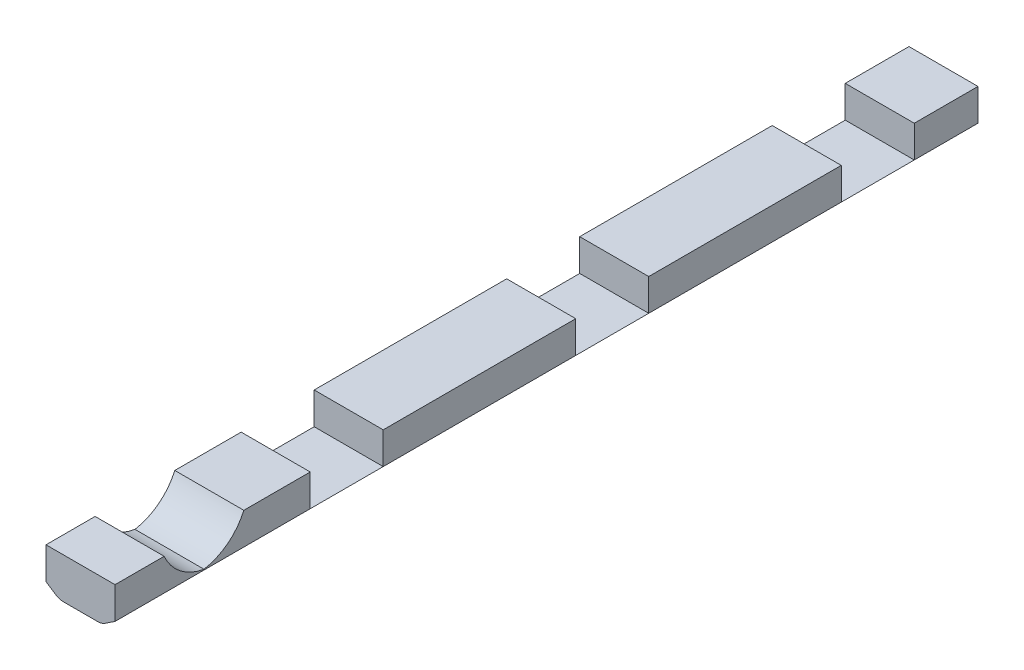
ISO-10303-21;
HEADER;
FILE_DESCRIPTION(('STEP AP214'),'2;1');
FILE_NAME('part.step','',(''),(''),'','','');
FILE_SCHEMA(('AUTOMOTIVE_DESIGN { 1 0 10303 214 1 1 1 1 }'));
ENDSEC;
DATA;
#1=APPLICATION_CONTEXT('core data for automotive mechanical design processes');
#2=APPLICATION_PROTOCOL_DEFINITION('international standard','automotive_design',2000,#1);
#3=PRODUCT_CONTEXT('',#1,'mechanical');
#4=PRODUCT('Part','Part','',(#3));
#5=PRODUCT_RELATED_PRODUCT_CATEGORY('part','',(#4));
#6=PRODUCT_DEFINITION_FORMATION('','',#4);
#7=PRODUCT_DEFINITION_CONTEXT('part definition',#1,'design');
#8=PRODUCT_DEFINITION('design','',#6,#7);
#9=PRODUCT_DEFINITION_SHAPE('','',#8);
#10=(LENGTH_UNIT() NAMED_UNIT(*) SI_UNIT(.MILLI.,.METRE.));
#11=(NAMED_UNIT(*) PLANE_ANGLE_UNIT() SI_UNIT($,.RADIAN.));
#12=(NAMED_UNIT(*) SI_UNIT($,.STERADIAN.) SOLID_ANGLE_UNIT());
#13=UNCERTAINTY_MEASURE_WITH_UNIT(LENGTH_MEASURE(1.E-05),#10,'distance_accuracy_value','');
#14=(GEOMETRIC_REPRESENTATION_CONTEXT(3) GLOBAL_UNCERTAINTY_ASSIGNED_CONTEXT((#13)) GLOBAL_UNIT_ASSIGNED_CONTEXT((#10,
#11,#12)) REPRESENTATION_CONTEXT('',''));
#15=CARTESIAN_POINT('',(0.,0.,0.));
#16=DIRECTION('',(0.,0.,1.));
#17=DIRECTION('',(1.,0.,0.));
#18=AXIS2_PLACEMENT_3D('',#15,#16,#17);
#19=CARTESIAN_POINT('',(5.,4.66332495807108,57.6339394440353));
#20=DIRECTION('',(1.,0.,0.));
#21=DIRECTION('',(0.,0.,-1.));
#22=AXIS2_PLACEMENT_3D('',#19,#20,#21);
#23=CYLINDRICAL_SURFACE('',#22,4.);
#24=CARTESIAN_POINT('',(4.2,4.66332495807108,57.6339394440353));
#25=DIRECTION('',(-1.,0.,0.));
#26=DIRECTION('',(0.,0.,1.));
#27=AXIS2_PLACEMENT_3D('',#24,#25,#26);
#28=CIRCLE('',#27,4.);
#29=CARTESIAN_POINT('',(4.2,0.719169365832354,58.3));
#30=VERTEX_POINT('',#29);
#31=CARTESIAN_POINT('',(4.2,3.06332495807108,61.3));
#32=VERTEX_POINT('',#31);
#33=EDGE_CURVE('E201',#30,#32,#28,.T.);
#34=ORIENTED_EDGE('',*,*,#33,.F.);
#35=DIRECTION('',(-1.,0.,0.));
#36=VECTOR('',#35,1.);
#37=CARTESIAN_POINT('',(1.6,0.719169365832354,58.3));
#38=LINE('',#37,#36);
#39=CARTESIAN_POINT('',(-0.999999999999999,0.719169365832354,58.3));
#40=VERTEX_POINT('',#39);
#41=EDGE_CURVE('E197',#40,#30,#38,.F.);
#42=ORIENTED_EDGE('',*,*,#41,.F.);
#43=CARTESIAN_POINT('',(-1.,4.66332495807108,57.6339394440353));
#44=DIRECTION('',(1.,0.,0.));
#45=DIRECTION('',(0.,1.,0.));
#46=AXIS2_PLACEMENT_3D('',#43,#44,#45);
#47=CIRCLE('',#46,4.);
#48=CARTESIAN_POINT('',(-1.,3.06332495807108,61.3));
#49=VERTEX_POINT('',#48);
#50=EDGE_CURVE('E192',#49,#40,#47,.T.);
#51=ORIENTED_EDGE('',*,*,#50,.F.);
#52=DIRECTION('',(-1.,0.,0.));
#53=VECTOR('',#52,1.);
#54=CARTESIAN_POINT('',(5.,3.06332495807108,61.3));
#55=LINE('',#54,#53);
#56=EDGE_CURVE('E195',#32,#49,#55,.T.);
#57=ORIENTED_EDGE('',*,*,#56,.F.);
#58=EDGE_LOOP('',(#34,#42,#51,#57));
#59=FACE_BOUND('',#58,.T.);
#60=ADVANCED_FACE('F37',(#59),#23,.F.);
#61=CARTESIAN_POINT('',(4.2,3.06332495807108,65.));
#62=DIRECTION('',(0.,-1.,0.));
#63=DIRECTION('',(0.,0.,-1.));
#64=AXIS2_PLACEMENT_3D('',#61,#62,#63);
#65=PLANE('',#64);
#66=DIRECTION('',(0.,0.,-1.));
#67=VECTOR('',#66,1.);
#68=CARTESIAN_POINT('',(4.2,3.06332495807108,65.));
#69=LINE('',#68,#67);
#70=CARTESIAN_POINT('',(4.2,3.06332495807108,65.));
#71=VERTEX_POINT('',#70);
#72=EDGE_CURVE('E211',#71,#32,#69,.T.);
#73=ORIENTED_EDGE('',*,*,#72,.T.);
#74=ORIENTED_EDGE('',*,*,#56,.T.);
#75=DIRECTION('',(0.,0.,-1.));
#76=VECTOR('',#75,1.);
#77=CARTESIAN_POINT('',(-1.,3.06332495807108,65.));
#78=LINE('',#77,#76);
#79=CARTESIAN_POINT('',(-1.,3.06332495807108,65.));
#80=VERTEX_POINT('',#79);
#81=EDGE_CURVE('E208',#80,#49,#78,.T.);
#82=ORIENTED_EDGE('',*,*,#81,.F.);
#83=DIRECTION('',(-1.,0.,0.));
#84=VECTOR('',#83,1.);
#85=CARTESIAN_POINT('',(4.2,3.06332495807108,65.));
#86=LINE('',#85,#84);
#87=EDGE_CURVE('E340',#71,#80,#86,.T.);
#88=ORIENTED_EDGE('',*,*,#87,.F.);
#89=EDGE_LOOP('',(#73,#74,#82,#88));
#90=FACE_BOUND('',#89,.T.);
#91=ADVANCED_FACE('F206',(#90),#65,.F.);
#92=CARTESIAN_POINT('',(4.2,0.66332495807108,65.));
#93=DIRECTION('',(-1.,0.,0.));
#94=DIRECTION('',(0.,0.,1.));
#95=AXIS2_PLACEMENT_3D('',#92,#93,#94);
#96=PLANE('',#95);
#97=CARTESIAN_POINT('',(4.2,3.06332495807108,24.8));
#98=VERTEX_POINT('',#97);
#99=CARTESIAN_POINT('',(4.2,3.06332495807108,10.3));
#100=VERTEX_POINT('',#99);
#101=EDGE_CURVE('E223',#98,#100,#69,.T.);
#102=ORIENTED_EDGE('',*,*,#101,.F.);
#103=DIRECTION('',(0.,-1.,0.));
#104=VECTOR('',#103,1.);
#105=CARTESIAN_POINT('',(4.2,0.663324958071065,24.8));
#106=LINE('',#105,#104);
#107=CARTESIAN_POINT('',(4.2,0.663324958071081,24.8));
#108=VERTEX_POINT('',#107);
#109=EDGE_CURVE('E299',#98,#108,#106,.T.);
#110=ORIENTED_EDGE('',*,*,#109,.T.);
#111=DIRECTION('',(0.,0.,-1.));
#112=VECTOR('',#111,1.);
#113=CARTESIAN_POINT('',(4.2,0.66332495807108,65.));
#114=LINE('',#113,#112);
#115=CARTESIAN_POINT('',(4.2,0.663324958071081,10.3));
#116=VERTEX_POINT('',#115);
#117=EDGE_CURVE('E387',#108,#116,#114,.T.);
#118=ORIENTED_EDGE('',*,*,#117,.T.);
#119=DIRECTION('',(0.,1.,0.));
#120=VECTOR('',#119,1.);
#121=CARTESIAN_POINT('',(4.2,0.66332495807108,10.3));
#122=LINE('',#121,#120);
#123=EDGE_CURVE('E324',#116,#100,#122,.T.);
#124=ORIENTED_EDGE('',*,*,#123,.T.);
#125=EDGE_LOOP('',(#102,#110,#118,#124));
#126=FACE_BOUND('',#125,.T.);
#127=ADVANCED_FACE('F406',(#126),#96,.F.);
#128=CARTESIAN_POINT('',(4.2,0.663324958071081,44.8));
#129=VERTEX_POINT('',#128);
#130=CARTESIAN_POINT('',(4.2,0.663324958071081,30.3));
#131=VERTEX_POINT('',#130);
#132=EDGE_CURVE('E386',#129,#131,#114,.T.);
#133=ORIENTED_EDGE('',*,*,#132,.T.);
#134=DIRECTION('',(0.,1.,0.));
#135=VECTOR('',#134,1.);
#136=CARTESIAN_POINT('',(4.2,0.66332495807108,30.3));
#137=LINE('',#136,#135);
#138=CARTESIAN_POINT('',(4.2,3.06332495807108,30.3));
#139=VERTEX_POINT('',#138);
#140=EDGE_CURVE('E297',#131,#139,#137,.T.);
#141=ORIENTED_EDGE('',*,*,#140,.T.);
#142=CARTESIAN_POINT('',(4.2,3.06332495807108,44.8));
#143=VERTEX_POINT('',#142);
#144=EDGE_CURVE('E225',#143,#139,#69,.T.);
#145=ORIENTED_EDGE('',*,*,#144,.F.);
#146=DIRECTION('',(0.,-1.,0.));
#147=VECTOR('',#146,1.);
#148=CARTESIAN_POINT('',(4.2,0.663324958071072,44.8));
#149=LINE('',#148,#147);
#150=EDGE_CURVE('E291',#143,#129,#149,.T.);
#151=ORIENTED_EDGE('',*,*,#150,.T.);
#152=EDGE_LOOP('',(#133,#141,#145,#151));
#153=FACE_BOUND('',#152,.T.);
#154=ADVANCED_FACE('F412',(#153),#96,.F.);
#155=CARTESIAN_POINT('',(-1.,3.06332495807108,24.8));
#156=VERTEX_POINT('',#155);
#157=CARTESIAN_POINT('',(-1.,3.06332495807108,10.3));
#158=VERTEX_POINT('',#157);
#159=EDGE_CURVE('E227',#156,#158,#78,.T.);
#160=ORIENTED_EDGE('',*,*,#159,.F.);
#161=DIRECTION('',(-1.,0.,0.));
#162=VECTOR('',#161,1.);
#163=CARTESIAN_POINT('',(5.,3.06332495807108,24.8));
#164=LINE('',#163,#162);
#165=EDGE_CURVE('E257',#98,#156,#164,.T.);
#166=ORIENTED_EDGE('',*,*,#165,.F.);
#167=ORIENTED_EDGE('',*,*,#101,.T.);
#168=DIRECTION('',(-1.,0.,0.));
#169=VECTOR('',#168,1.);
#170=CARTESIAN_POINT('',(5.,3.06332495807108,10.3));
#171=LINE('',#170,#169);
#172=EDGE_CURVE('E314',#100,#158,#171,.T.);
#173=ORIENTED_EDGE('',*,*,#172,.T.);
#174=EDGE_LOOP('',(#160,#166,#167,#173));
#175=FACE_BOUND('',#174,.T.);
#176=ADVANCED_FACE('F399',(#175),#65,.F.);
#177=ORIENTED_EDGE('',*,*,#144,.T.);
#178=DIRECTION('',(-1.,0.,0.));
#179=VECTOR('',#178,1.);
#180=CARTESIAN_POINT('',(5.,3.06332495807108,30.3));
#181=LINE('',#180,#179);
#182=CARTESIAN_POINT('',(-1.,3.06332495807108,30.3));
#183=VERTEX_POINT('',#182);
#184=EDGE_CURVE('E254',#139,#183,#181,.T.);
#185=ORIENTED_EDGE('',*,*,#184,.T.);
#186=CARTESIAN_POINT('',(-1.,3.06332495807108,44.8));
#187=VERTEX_POINT('',#186);
#188=EDGE_CURVE('E226',#187,#183,#78,.T.);
#189=ORIENTED_EDGE('',*,*,#188,.F.);
#190=DIRECTION('',(-1.,0.,0.));
#191=VECTOR('',#190,1.);
#192=CARTESIAN_POINT('',(5.,3.06332495807108,44.8));
#193=LINE('',#192,#191);
#194=EDGE_CURVE('E252',#143,#187,#193,.T.);
#195=ORIENTED_EDGE('',*,*,#194,.F.);
#196=EDGE_LOOP('',(#177,#185,#189,#195));
#197=FACE_BOUND('',#196,.T.);
#198=ADVANCED_FACE('F251',(#197),#65,.F.);
#199=CARTESIAN_POINT('',(-1.,3.06332495807108,65.));
#200=DIRECTION('',(1.,0.,0.));
#201=DIRECTION('',(0.,1.,0.));
#202=AXIS2_PLACEMENT_3D('',#199,#200,#201);
#203=PLANE('',#202);
#204=DIRECTION('',(0.,0.,-1.));
#205=VECTOR('',#204,1.);
#206=CARTESIAN_POINT('',(-1.,0.663324958071081,65.));
#207=LINE('',#206,#205);
#208=CARTESIAN_POINT('',(-1.,0.663324958071081,24.8));
#209=VERTEX_POINT('',#208);
#210=CARTESIAN_POINT('',(-1.,0.663324958071081,10.3));
#211=VERTEX_POINT('',#210);
#212=EDGE_CURVE('E236',#209,#211,#207,.T.);
#213=ORIENTED_EDGE('',*,*,#212,.F.);
#214=DIRECTION('',(0.,-1.,0.));
#215=VECTOR('',#214,1.);
#216=CARTESIAN_POINT('',(-1.,3.06332495807108,24.8));
#217=LINE('',#216,#215);
#218=EDGE_CURVE('E277',#156,#209,#217,.T.);
#219=ORIENTED_EDGE('',*,*,#218,.F.);
#220=ORIENTED_EDGE('',*,*,#159,.T.);
#221=DIRECTION('',(0.,1.,0.));
#222=VECTOR('',#221,1.);
#223=CARTESIAN_POINT('',(-1.,3.06332495807108,10.3));
#224=LINE('',#223,#222);
#225=EDGE_CURVE('E307',#211,#158,#224,.T.);
#226=ORIENTED_EDGE('',*,*,#225,.F.);
#227=EDGE_LOOP('',(#213,#219,#220,#226));
#228=FACE_BOUND('',#227,.T.);
#229=ADVANCED_FACE('F477',(#228),#203,.F.);
#230=ORIENTED_EDGE('',*,*,#188,.T.);
#231=DIRECTION('',(0.,1.,0.));
#232=VECTOR('',#231,1.);
#233=CARTESIAN_POINT('',(-1.,3.06332495807108,30.3));
#234=LINE('',#233,#232);
#235=CARTESIAN_POINT('',(-1.,0.663324958071081,30.3));
#236=VERTEX_POINT('',#235);
#237=EDGE_CURVE('E245',#236,#183,#234,.T.);
#238=ORIENTED_EDGE('',*,*,#237,.F.);
#239=CARTESIAN_POINT('',(-1.,0.663324958071081,44.8));
#240=VERTEX_POINT('',#239);
#241=EDGE_CURVE('E235',#240,#236,#207,.T.);
#242=ORIENTED_EDGE('',*,*,#241,.F.);
#243=DIRECTION('',(0.,-1.,0.));
#244=VECTOR('',#243,1.);
#245=CARTESIAN_POINT('',(-1.,3.06332495807108,44.8));
#246=LINE('',#245,#244);
#247=EDGE_CURVE('E212',#187,#240,#246,.T.);
#248=ORIENTED_EDGE('',*,*,#247,.F.);
#249=EDGE_LOOP('',(#230,#238,#242,#248));
#250=FACE_BOUND('',#249,.T.);
#251=ADVANCED_FACE('F243',(#250),#203,.F.);
#252=CARTESIAN_POINT('',(4.2,3.06332495807108,4.8));
#253=VERTEX_POINT('',#252);
#254=CARTESIAN_POINT('',(4.2,3.06332495807108,0.));
#255=VERTEX_POINT('',#254);
#256=EDGE_CURVE('E219',#253,#255,#69,.T.);
#257=ORIENTED_EDGE('',*,*,#256,.F.);
#258=DIRECTION('',(0.,-1.,0.));
#259=VECTOR('',#258,1.);
#260=CARTESIAN_POINT('',(4.2,0.663324958071058,4.8));
#261=LINE('',#260,#259);
#262=CARTESIAN_POINT('',(4.2,0.663324958071081,4.8));
#263=VERTEX_POINT('',#262);
#264=EDGE_CURVE('E327',#253,#263,#261,.T.);
#265=ORIENTED_EDGE('',*,*,#264,.T.);
#266=CARTESIAN_POINT('',(4.2,0.66332495807108,0.));
#267=VERTEX_POINT('',#266);
#268=EDGE_CURVE('E388',#263,#267,#114,.T.);
#269=ORIENTED_EDGE('',*,*,#268,.T.);
#270=DIRECTION('',(0.,1.,0.));
#271=VECTOR('',#270,1.);
#272=CARTESIAN_POINT('',(4.2,0.66332495807108,0.));
#273=LINE('',#272,#271);
#274=EDGE_CURVE('E348',#267,#255,#273,.T.);
#275=ORIENTED_EDGE('',*,*,#274,.T.);
#276=EDGE_LOOP('',(#257,#265,#269,#275));
#277=FACE_BOUND('',#276,.T.);
#278=ADVANCED_FACE('F460',(#277),#96,.F.);
#279=CARTESIAN_POINT('',(-1.,3.06332495807108,4.8));
#280=VERTEX_POINT('',#279);
#281=CARTESIAN_POINT('',(-1.,3.06332495807108,0.));
#282=VERTEX_POINT('',#281);
#283=EDGE_CURVE('E222',#280,#282,#78,.T.);
#284=ORIENTED_EDGE('',*,*,#283,.F.);
#285=DIRECTION('',(-1.,0.,0.));
#286=VECTOR('',#285,1.);
#287=CARTESIAN_POINT('',(5.,3.06332495807108,4.8));
#288=LINE('',#287,#286);
#289=EDGE_CURVE('E311',#253,#280,#288,.T.);
#290=ORIENTED_EDGE('',*,*,#289,.F.);
#291=ORIENTED_EDGE('',*,*,#256,.T.);
#292=DIRECTION('',(-1.,0.,0.));
#293=VECTOR('',#292,1.);
#294=CARTESIAN_POINT('',(4.2,3.06332495807108,0.));
#295=LINE('',#294,#293);
#296=EDGE_CURVE('E351',#255,#282,#295,.T.);
#297=ORIENTED_EDGE('',*,*,#296,.T.);
#298=EDGE_LOOP('',(#284,#290,#291,#297));
#299=FACE_BOUND('',#298,.T.);
#300=ADVANCED_FACE('F466',(#299),#65,.F.);
#301=CARTESIAN_POINT('',(-1.,0.663324958071081,4.8));
#302=VERTEX_POINT('',#301);
#303=CARTESIAN_POINT('',(-1.,0.663324958071081,0.));
#304=VERTEX_POINT('',#303);
#305=EDGE_CURVE('E237',#302,#304,#207,.T.);
#306=ORIENTED_EDGE('',*,*,#305,.F.);
#307=DIRECTION('',(0.,-1.,0.));
#308=VECTOR('',#307,1.);
#309=CARTESIAN_POINT('',(-1.,3.06332495807108,4.8));
#310=LINE('',#309,#308);
#311=EDGE_CURVE('E302',#280,#302,#310,.T.);
#312=ORIENTED_EDGE('',*,*,#311,.F.);
#313=ORIENTED_EDGE('',*,*,#283,.T.);
#314=DIRECTION('',(0.,-1.,0.));
#315=VECTOR('',#314,1.);
#316=CARTESIAN_POINT('',(-1.,3.06332495807108,0.));
#317=LINE('',#316,#315);
#318=EDGE_CURVE('E334',#282,#304,#317,.T.);
#319=ORIENTED_EDGE('',*,*,#318,.T.);
#320=EDGE_LOOP('',(#306,#312,#313,#319));
#321=FACE_BOUND('',#320,.T.);
#322=ADVANCED_FACE('F355',(#321),#203,.F.);
#323=CARTESIAN_POINT('',(-1.,0.663324958071081,65.));
#324=DIRECTION('',(0.552770798392567,0.833333333333333,0.));
#325=DIRECTION('',(-0.833333333333333,0.552770798392567,0.));
#326=AXIS2_PLACEMENT_3D('',#323,#324,#325);
#327=PLANE('',#326);
#328=DIRECTION('',(0.833333333333333,-0.552770798392567,0.));
#329=VECTOR('',#328,1.);
#330=CARTESIAN_POINT('',(-1.,0.663324958071081,0.));
#331=LINE('',#330,#329);
#332=CARTESIAN_POINT('',(-0.251259453814803,0.166666666666667,0.));
#333=VERTEX_POINT('',#332);
#334=EDGE_CURVE('E330',#304,#333,#331,.T.);
#335=ORIENTED_EDGE('',*,*,#334,.T.);
#336=DIRECTION('',(0.,0.,-1.));
#337=VECTOR('',#336,1.);
#338=CARTESIAN_POINT('',(-0.251259453814803,0.166666666666667,65.));
#339=LINE('',#338,#337);
#340=CARTESIAN_POINT('',(-0.251259453814803,0.166666666666667,65.));
#341=VERTEX_POINT('',#340);
#342=EDGE_CURVE('E45',#333,#341,#339,.F.);
#343=ORIENTED_EDGE('',*,*,#342,.T.);
#344=DIRECTION('',(0.833333333333333,-0.552770798392567,0.));
#345=VECTOR('',#344,1.);
#346=CARTESIAN_POINT('',(-1.,0.663324958071081,65.));
#347=LINE('',#346,#345);
#348=CARTESIAN_POINT('',(-1.,0.663324958071081,65.));
#349=VERTEX_POINT('',#348);
#350=EDGE_CURVE('E331',#349,#341,#347,.T.);
#351=ORIENTED_EDGE('',*,*,#350,.F.);
#352=CARTESIAN_POINT('',(-1.,0.663324958071081,50.3));
#353=VERTEX_POINT('',#352);
#354=EDGE_CURVE('E229',#349,#353,#207,.T.);
#355=ORIENTED_EDGE('',*,*,#354,.T.);
#356=DIRECTION('',(0.,0.,1.));
#357=VECTOR('',#356,1.);
#358=CARTESIAN_POINT('',(-1.,0.663324958071081,44.8));
#359=LINE('',#358,#357);
#360=EDGE_CURVE('E269',#240,#353,#359,.T.);
#361=ORIENTED_EDGE('',*,*,#360,.F.);
#362=ORIENTED_EDGE('',*,*,#241,.T.);
#363=DIRECTION('',(0.,0.,1.));
#364=VECTOR('',#363,1.);
#365=CARTESIAN_POINT('',(-1.,0.663324958071081,24.8));
#366=LINE('',#365,#364);
#367=EDGE_CURVE('E426',#209,#236,#366,.T.);
#368=ORIENTED_EDGE('',*,*,#367,.F.);
#369=ORIENTED_EDGE('',*,*,#212,.T.);
#370=DIRECTION('',(0.,0.,1.));
#371=VECTOR('',#370,1.);
#372=CARTESIAN_POINT('',(-1.,0.663324958071081,4.8));
#373=LINE('',#372,#371);
#374=EDGE_CURVE('E304',#302,#211,#373,.T.);
#375=ORIENTED_EDGE('',*,*,#374,.F.);
#376=ORIENTED_EDGE('',*,*,#305,.T.);
#377=EDGE_LOOP('',(#335,#343,#351,#355,#361,#362,#368,#369,#375,#376));
#378=FACE_BOUND('',#377,.T.);
#379=ADVANCED_FACE('F359',(#378),#327,.F.);
#380=CARTESIAN_POINT('',(0.,0.,65.));
#381=DIRECTION('',(0.,1.,0.));
#382=DIRECTION('',(0.,0.,1.));
#383=AXIS2_PLACEMENT_3D('',#380,#381,#382);
#384=PLANE('',#383);
#385=DIRECTION('',(1.,0.,0.));
#386=VECTOR('',#385,1.);
#387=CARTESIAN_POINT('',(0.,0.,65.));
#388=LINE('',#387,#386);
#389=CARTESIAN_POINT('',(0.301511344577764,0.,65.));
#390=VERTEX_POINT('',#389);
#391=CARTESIAN_POINT('',(2.89848865542224,0.,65.));
#392=VERTEX_POINT('',#391);
#393=EDGE_CURVE('E333',#390,#392,#388,.T.);
#394=ORIENTED_EDGE('',*,*,#393,.F.);
#395=DIRECTION('',(0.,0.,-1.));
#396=VECTOR('',#395,1.);
#397=CARTESIAN_POINT('',(0.301511344577764,0.,65.));
#398=LINE('',#397,#396);
#399=CARTESIAN_POINT('',(0.301511344577764,0.,0.));
#400=VERTEX_POINT('',#399);
#401=EDGE_CURVE('E364',#390,#400,#398,.T.);
#402=ORIENTED_EDGE('',*,*,#401,.T.);
#403=DIRECTION('',(1.,0.,0.));
#404=VECTOR('',#403,1.);
#405=CARTESIAN_POINT('',(0.,0.,0.));
#406=LINE('',#405,#404);
#407=CARTESIAN_POINT('',(2.89848865542224,0.,0.));
#408=VERTEX_POINT('',#407);
#409=EDGE_CURVE('E344',#400,#408,#406,.T.);
#410=ORIENTED_EDGE('',*,*,#409,.T.);
#411=DIRECTION('',(0.,0.,-1.));
#412=VECTOR('',#411,1.);
#413=CARTESIAN_POINT('',(2.89848865542224,0.,65.));
#414=LINE('',#413,#412);
#415=EDGE_CURVE('E370',#408,#392,#414,.F.);
#416=ORIENTED_EDGE('',*,*,#415,.T.);
#417=EDGE_LOOP('',(#394,#402,#410,#416));
#418=FACE_BOUND('',#417,.T.);
#419=ADVANCED_FACE('F606',(#418),#384,.F.);
#420=CARTESIAN_POINT('',(3.2,0.,65.));
#421=DIRECTION('',(-0.552770798392567,0.833333333333333,0.));
#422=DIRECTION('',(-0.833333333333333,-0.552770798392567,0.));
#423=AXIS2_PLACEMENT_3D('',#420,#421,#422);
#424=PLANE('',#423);
#425=DIRECTION('',(0.833333333333333,0.552770798392567,0.));
#426=VECTOR('',#425,1.);
#427=CARTESIAN_POINT('',(3.2,0.,65.));
#428=LINE('',#427,#426);
#429=CARTESIAN_POINT('',(3.4512594538148,0.166666666666667,65.));
#430=VERTEX_POINT('',#429);
#431=CARTESIAN_POINT('',(4.2,0.66332495807108,65.));
#432=VERTEX_POINT('',#431);
#433=EDGE_CURVE('E336',#430,#432,#428,.T.);
#434=ORIENTED_EDGE('',*,*,#433,.F.);
#435=DIRECTION('',(0.,0.,-1.));
#436=VECTOR('',#435,1.);
#437=CARTESIAN_POINT('',(3.4512594538148,0.166666666666667,65.));
#438=LINE('',#437,#436);
#439=CARTESIAN_POINT('',(3.4512594538148,0.166666666666667,0.));
#440=VERTEX_POINT('',#439);
#441=EDGE_CURVE('E376',#430,#440,#438,.T.);
#442=ORIENTED_EDGE('',*,*,#441,.T.);
#443=DIRECTION('',(0.833333333333333,0.552770798392567,0.));
#444=VECTOR('',#443,1.);
#445=CARTESIAN_POINT('',(3.2,0.,0.));
#446=LINE('',#445,#444);
#447=EDGE_CURVE('E346',#440,#267,#446,.T.);
#448=ORIENTED_EDGE('',*,*,#447,.T.);
#449=ORIENTED_EDGE('',*,*,#268,.F.);
#450=DIRECTION('',(0.,0.,1.));
#451=VECTOR('',#450,1.);
#452=CARTESIAN_POINT('',(4.2,0.663324958071081,65.));
#453=LINE('',#452,#451);
#454=EDGE_CURVE('E313',#263,#116,#453,.T.);
#455=ORIENTED_EDGE('',*,*,#454,.T.);
#456=ORIENTED_EDGE('',*,*,#117,.F.);
#457=DIRECTION('',(0.,0.,1.));
#458=VECTOR('',#457,1.);
#459=CARTESIAN_POINT('',(4.2,0.663324958071081,65.));
#460=LINE('',#459,#458);
#461=EDGE_CURVE('E294',#108,#131,#460,.T.);
#462=ORIENTED_EDGE('',*,*,#461,.T.);
#463=ORIENTED_EDGE('',*,*,#132,.F.);
#464=DIRECTION('',(0.,0.,1.));
#465=VECTOR('',#464,1.);
#466=CARTESIAN_POINT('',(4.2,0.663324958071081,65.));
#467=LINE('',#466,#465);
#468=CARTESIAN_POINT('',(4.2,0.663324958071081,50.3));
#469=VERTEX_POINT('',#468);
#470=EDGE_CURVE('E260',#129,#469,#467,.T.);
#471=ORIENTED_EDGE('',*,*,#470,.T.);
#472=EDGE_CURVE('E385',#432,#469,#114,.T.);
#473=ORIENTED_EDGE('',*,*,#472,.F.);
#474=EDGE_LOOP('',(#434,#442,#448,#449,#455,#456,#462,#463,#471,#473));
#475=FACE_BOUND('',#474,.T.);
#476=ADVANCED_FACE('F414',(#475),#424,.F.);
#477=CARTESIAN_POINT('',(4.2,4.66332495807108,58.9660605559647));
#478=DIRECTION('',(-1.,0.,0.));
#479=DIRECTION('',(0.,0.,1.));
#480=AXIS2_PLACEMENT_3D('',#477,#478,#479);
#481=CIRCLE('',#480,4.);
#482=CARTESIAN_POINT('',(4.2,3.06332495807108,55.3));
#483=VERTEX_POINT('',#482);
#484=EDGE_CURVE('E381',#483,#30,#481,.T.);
#485=ORIENTED_EDGE('',*,*,#484,.T.);
#486=ORIENTED_EDGE('',*,*,#33,.T.);
#487=ORIENTED_EDGE('',*,*,#72,.F.);
#488=DIRECTION('',(0.,1.,0.));
#489=VECTOR('',#488,1.);
#490=CARTESIAN_POINT('',(4.2,0.66332495807108,65.));
#491=LINE('',#490,#489);
#492=EDGE_CURVE('E338',#432,#71,#491,.T.);
#493=ORIENTED_EDGE('',*,*,#492,.F.);
#494=ORIENTED_EDGE('',*,*,#472,.T.);
#495=DIRECTION('',(0.,1.,0.));
#496=VECTOR('',#495,1.);
#497=CARTESIAN_POINT('',(4.2,0.66332495807108,50.3));
#498=LINE('',#497,#496);
#499=CARTESIAN_POINT('',(4.2,3.06332495807108,50.3));
#500=VERTEX_POINT('',#499);
#501=EDGE_CURVE('E288',#469,#500,#498,.T.);
#502=ORIENTED_EDGE('',*,*,#501,.T.);
#503=EDGE_CURVE('E389',#483,#500,#69,.T.);
#504=ORIENTED_EDGE('',*,*,#503,.F.);
#505=EDGE_LOOP('',(#485,#486,#487,#493,#494,#502,#504));
#506=FACE_BOUND('',#505,.T.);
#507=ADVANCED_FACE('F447',(#506),#96,.F.);
#508=CARTESIAN_POINT('',(-1.,3.06332495807108,55.3));
#509=VERTEX_POINT('',#508);
#510=CARTESIAN_POINT('',(-1.,3.06332495807108,50.3));
#511=VERTEX_POINT('',#510);
#512=EDGE_CURVE('E220',#509,#511,#78,.T.);
#513=ORIENTED_EDGE('',*,*,#512,.F.);
#514=DIRECTION('',(-1.,0.,0.));
#515=VECTOR('',#514,1.);
#516=CARTESIAN_POINT('',(5.,3.06332495807108,55.3));
#517=LINE('',#516,#515);
#518=EDGE_CURVE('E213',#483,#509,#517,.T.);
#519=ORIENTED_EDGE('',*,*,#518,.F.);
#520=ORIENTED_EDGE('',*,*,#503,.T.);
#521=DIRECTION('',(-1.,0.,0.));
#522=VECTOR('',#521,1.);
#523=CARTESIAN_POINT('',(5.,3.06332495807108,50.3));
#524=LINE('',#523,#522);
#525=EDGE_CURVE('E278',#500,#511,#524,.T.);
#526=ORIENTED_EDGE('',*,*,#525,.T.);
#527=EDGE_LOOP('',(#513,#519,#520,#526));
#528=FACE_BOUND('',#527,.T.);
#529=ADVANCED_FACE('F441',(#528),#65,.F.);
#530=DIRECTION('',(0.,1.,0.));
#531=VECTOR('',#530,1.);
#532=CARTESIAN_POINT('',(-1.,3.06332495807108,50.3));
#533=LINE('',#532,#531);
#534=EDGE_CURVE('E272',#353,#511,#533,.T.);
#535=ORIENTED_EDGE('',*,*,#534,.F.);
#536=ORIENTED_EDGE('',*,*,#354,.F.);
#537=DIRECTION('',(0.,-1.,0.));
#538=VECTOR('',#537,1.);
#539=CARTESIAN_POINT('',(-1.,3.06332495807108,65.));
#540=LINE('',#539,#538);
#541=EDGE_CURVE('E218',#80,#349,#540,.T.);
#542=ORIENTED_EDGE('',*,*,#541,.F.);
#543=ORIENTED_EDGE('',*,*,#81,.T.);
#544=ORIENTED_EDGE('',*,*,#50,.T.);
#545=CARTESIAN_POINT('',(-1.,4.66332495807108,58.9660605559647));
#546=DIRECTION('',(1.,0.,0.));
#547=DIRECTION('',(0.,1.,0.));
#548=AXIS2_PLACEMENT_3D('',#545,#546,#547);
#549=CIRCLE('',#548,4.);
#550=EDGE_CURVE('E383',#40,#509,#549,.T.);
#551=ORIENTED_EDGE('',*,*,#550,.T.);
#552=ORIENTED_EDGE('',*,*,#512,.T.);
#553=EDGE_LOOP('',(#535,#536,#542,#543,#544,#551,#552));
#554=FACE_BOUND('',#553,.T.);
#555=ADVANCED_FACE('F216',(#554),#203,.F.);
#556=CARTESIAN_POINT('',(0.,0.,65.));
#557=DIRECTION('',(0.,0.,1.));
#558=DIRECTION('',(1.,0.,0.));
#559=AXIS2_PLACEMENT_3D('',#556,#557,#558);
#560=PLANE('',#559);
#561=ORIENTED_EDGE('',*,*,#350,.T.);
#562=CARTESIAN_POINT('',(0.301511344577764,1.,65.));
#563=DIRECTION('',(0.,0.,1.));
#564=DIRECTION('',(1.,0.,0.));
#565=AXIS2_PLACEMENT_3D('',#562,#563,#564);
#566=CIRCLE('',#565,1.);
#567=EDGE_CURVE('E11',#341,#390,#566,.T.);
#568=ORIENTED_EDGE('',*,*,#567,.T.);
#569=ORIENTED_EDGE('',*,*,#393,.T.);
#570=CARTESIAN_POINT('',(2.89848865542224,1.,65.));
#571=DIRECTION('',(0.,0.,1.));
#572=DIRECTION('',(1.,0.,0.));
#573=AXIS2_PLACEMENT_3D('',#570,#571,#572);
#574=CIRCLE('',#573,1.);
#575=EDGE_CURVE('E368',#392,#430,#574,.T.);
#576=ORIENTED_EDGE('',*,*,#575,.T.);
#577=ORIENTED_EDGE('',*,*,#433,.T.);
#578=ORIENTED_EDGE('',*,*,#492,.T.);
#579=ORIENTED_EDGE('',*,*,#87,.T.);
#580=ORIENTED_EDGE('',*,*,#541,.T.);
#581=EDGE_LOOP('',(#561,#568,#569,#576,#577,#578,#579,#580));
#582=FACE_BOUND('',#581,.T.);
#583=ADVANCED_FACE('F517',(#582),#560,.T.);
#584=CARTESIAN_POINT('',(0.,0.,0.));
#585=DIRECTION('',(0.,0.,1.));
#586=DIRECTION('',(1.,0.,0.));
#587=AXIS2_PLACEMENT_3D('',#584,#585,#586);
#588=PLANE('',#587);
#589=ORIENTED_EDGE('',*,*,#409,.F.);
#590=CARTESIAN_POINT('',(0.301511344577764,1.,0.));
#591=DIRECTION('',(0.,0.,1.));
#592=DIRECTION('',(1.,0.,0.));
#593=AXIS2_PLACEMENT_3D('',#590,#591,#592);
#594=CIRCLE('',#593,1.);
#595=EDGE_CURVE('E59',#400,#333,#594,.F.);
#596=ORIENTED_EDGE('',*,*,#595,.T.);
#597=ORIENTED_EDGE('',*,*,#334,.F.);
#598=ORIENTED_EDGE('',*,*,#318,.F.);
#599=ORIENTED_EDGE('',*,*,#296,.F.);
#600=ORIENTED_EDGE('',*,*,#274,.F.);
#601=ORIENTED_EDGE('',*,*,#447,.F.);
#602=CARTESIAN_POINT('',(2.89848865542224,1.,0.));
#603=DIRECTION('',(0.,0.,1.));
#604=DIRECTION('',(1.,0.,0.));
#605=AXIS2_PLACEMENT_3D('',#602,#603,#604);
#606=CIRCLE('',#605,1.);
#607=EDGE_CURVE('E373',#440,#408,#606,.F.);
#608=ORIENTED_EDGE('',*,*,#607,.T.);
#609=EDGE_LOOP('',(#589,#596,#597,#598,#599,#600,#601,#608));
#610=FACE_BOUND('',#609,.T.);
#611=ADVANCED_FACE('F358',(#610),#588,.F.);
#612=CARTESIAN_POINT('',(5.,3.06332495807108,4.8));
#613=DIRECTION('',(0.,0.,-1.));
#614=DIRECTION('',(0.,1.,0.));
#615=AXIS2_PLACEMENT_3D('',#612,#613,#614);
#616=PLANE('',#615);
#617=ORIENTED_EDGE('',*,*,#289,.T.);
#618=ORIENTED_EDGE('',*,*,#311,.T.);
#619=DIRECTION('',(-1.,0.,0.));
#620=VECTOR('',#619,1.);
#621=CARTESIAN_POINT('',(5.,0.663324958071082,4.8));
#622=LINE('',#621,#620);
#623=EDGE_CURVE('E310',#263,#302,#622,.T.);
#624=ORIENTED_EDGE('',*,*,#623,.F.);
#625=ORIENTED_EDGE('',*,*,#264,.F.);
#626=EDGE_LOOP('',(#617,#618,#624,#625));
#627=FACE_BOUND('',#626,.T.);
#628=ADVANCED_FACE('F464',(#627),#616,.F.);
#629=CARTESIAN_POINT('',(5.,3.06332495807108,10.3));
#630=DIRECTION('',(0.,0.,1.));
#631=DIRECTION('',(1.,0.,0.));
#632=AXIS2_PLACEMENT_3D('',#629,#630,#631);
#633=PLANE('',#632);
#634=DIRECTION('',(-1.,0.,0.));
#635=VECTOR('',#634,1.);
#636=CARTESIAN_POINT('',(5.,0.663324958071082,10.3));
#637=LINE('',#636,#635);
#638=EDGE_CURVE('E317',#116,#211,#637,.T.);
#639=ORIENTED_EDGE('',*,*,#638,.T.);
#640=ORIENTED_EDGE('',*,*,#225,.T.);
#641=ORIENTED_EDGE('',*,*,#172,.F.);
#642=ORIENTED_EDGE('',*,*,#123,.F.);
#643=EDGE_LOOP('',(#639,#640,#641,#642));
#644=FACE_BOUND('',#643,.T.);
#645=ADVANCED_FACE('F403',(#644),#633,.F.);
#646=CARTESIAN_POINT('',(5.,0.663324958071082,4.8));
#647=DIRECTION('',(0.,-1.,0.));
#648=DIRECTION('',(1.,0.,0.));
#649=AXIS2_PLACEMENT_3D('',#646,#647,#648);
#650=PLANE('',#649);
#651=ORIENTED_EDGE('',*,*,#623,.T.);
#652=ORIENTED_EDGE('',*,*,#374,.T.);
#653=ORIENTED_EDGE('',*,*,#638,.F.);
#654=ORIENTED_EDGE('',*,*,#454,.F.);
#655=EDGE_LOOP('',(#651,#652,#653,#654));
#656=FACE_BOUND('',#655,.T.);
#657=ADVANCED_FACE('F508',(#656),#650,.F.);
#658=CARTESIAN_POINT('',(5.,3.06332495807108,44.8));
#659=DIRECTION('',(0.,0.,-1.));
#660=DIRECTION('',(0.,1.,0.));
#661=AXIS2_PLACEMENT_3D('',#658,#659,#660);
#662=PLANE('',#661);
#663=ORIENTED_EDGE('',*,*,#194,.T.);
#664=ORIENTED_EDGE('',*,*,#247,.T.);
#665=DIRECTION('',(-1.,0.,0.));
#666=VECTOR('',#665,1.);
#667=CARTESIAN_POINT('',(5.,0.663324958071082,44.8));
#668=LINE('',#667,#666);
#669=EDGE_CURVE('E275',#129,#240,#668,.T.);
#670=ORIENTED_EDGE('',*,*,#669,.F.);
#671=ORIENTED_EDGE('',*,*,#150,.F.);
#672=EDGE_LOOP('',(#663,#664,#670,#671));
#673=FACE_BOUND('',#672,.T.);
#674=ADVANCED_FACE('F503',(#673),#662,.F.);
#675=CARTESIAN_POINT('',(5.,3.06332495807108,50.3));
#676=DIRECTION('',(0.,0.,1.));
#677=DIRECTION('',(1.,0.,0.));
#678=AXIS2_PLACEMENT_3D('',#675,#676,#677);
#679=PLANE('',#678);
#680=DIRECTION('',(-1.,0.,0.));
#681=VECTOR('',#680,1.);
#682=CARTESIAN_POINT('',(5.,0.663324958071082,50.3));
#683=LINE('',#682,#681);
#684=EDGE_CURVE('E281',#469,#353,#683,.T.);
#685=ORIENTED_EDGE('',*,*,#684,.T.);
#686=ORIENTED_EDGE('',*,*,#534,.T.);
#687=ORIENTED_EDGE('',*,*,#525,.F.);
#688=ORIENTED_EDGE('',*,*,#501,.F.);
#689=EDGE_LOOP('',(#685,#686,#687,#688));
#690=FACE_BOUND('',#689,.T.);
#691=ADVANCED_FACE('F439',(#690),#679,.F.);
#692=CARTESIAN_POINT('',(5.,0.663324958071082,44.8));
#693=DIRECTION('',(0.,-1.,0.));
#694=DIRECTION('',(1.,0.,0.));
#695=AXIS2_PLACEMENT_3D('',#692,#693,#694);
#696=PLANE('',#695);
#697=ORIENTED_EDGE('',*,*,#669,.T.);
#698=ORIENTED_EDGE('',*,*,#360,.T.);
#699=ORIENTED_EDGE('',*,*,#684,.F.);
#700=ORIENTED_EDGE('',*,*,#470,.F.);
#701=EDGE_LOOP('',(#697,#698,#699,#700));
#702=FACE_BOUND('',#701,.T.);
#703=ADVANCED_FACE('F435',(#702),#696,.F.);
#704=CARTESIAN_POINT('',(5.,3.06332495807108,24.8));
#705=DIRECTION('',(0.,0.,-1.));
#706=DIRECTION('',(0.,1.,0.));
#707=AXIS2_PLACEMENT_3D('',#704,#705,#706);
#708=PLANE('',#707);
#709=ORIENTED_EDGE('',*,*,#165,.T.);
#710=ORIENTED_EDGE('',*,*,#218,.T.);
#711=DIRECTION('',(-1.,0.,0.));
#712=VECTOR('',#711,1.);
#713=CARTESIAN_POINT('',(5.,0.663324958071082,24.8));
#714=LINE('',#713,#712);
#715=EDGE_CURVE('E262',#108,#209,#714,.T.);
#716=ORIENTED_EDGE('',*,*,#715,.F.);
#717=ORIENTED_EDGE('',*,*,#109,.F.);
#718=EDGE_LOOP('',(#709,#710,#716,#717));
#719=FACE_BOUND('',#718,.T.);
#720=ADVANCED_FACE('F423',(#719),#708,.F.);
#721=CARTESIAN_POINT('',(5.,3.06332495807108,30.3));
#722=DIRECTION('',(0.,0.,1.));
#723=DIRECTION('',(1.,0.,0.));
#724=AXIS2_PLACEMENT_3D('',#721,#722,#723);
#725=PLANE('',#724);
#726=DIRECTION('',(-1.,0.,0.));
#727=VECTOR('',#726,1.);
#728=CARTESIAN_POINT('',(5.,0.663324958071082,30.3));
#729=LINE('',#728,#727);
#730=EDGE_CURVE('E258',#131,#236,#729,.T.);
#731=ORIENTED_EDGE('',*,*,#730,.T.);
#732=ORIENTED_EDGE('',*,*,#237,.T.);
#733=ORIENTED_EDGE('',*,*,#184,.F.);
#734=ORIENTED_EDGE('',*,*,#140,.F.);
#735=EDGE_LOOP('',(#731,#732,#733,#734));
#736=FACE_BOUND('',#735,.T.);
#737=ADVANCED_FACE('F430',(#736),#725,.F.);
#738=CARTESIAN_POINT('',(5.,0.663324958071082,24.8));
#739=DIRECTION('',(0.,-1.,0.));
#740=DIRECTION('',(1.,0.,0.));
#741=AXIS2_PLACEMENT_3D('',#738,#739,#740);
#742=PLANE('',#741);
#743=ORIENTED_EDGE('',*,*,#715,.T.);
#744=ORIENTED_EDGE('',*,*,#367,.T.);
#745=ORIENTED_EDGE('',*,*,#730,.F.);
#746=ORIENTED_EDGE('',*,*,#461,.F.);
#747=EDGE_LOOP('',(#743,#744,#745,#746));
#748=FACE_BOUND('',#747,.T.);
#749=ADVANCED_FACE('F419',(#748),#742,.F.);
#750=CARTESIAN_POINT('',(5.,4.66332495807108,58.9660605559647));
#751=DIRECTION('',(-1.,0.,0.));
#752=DIRECTION('',(0.,0.,1.));
#753=AXIS2_PLACEMENT_3D('',#750,#751,#752);
#754=CYLINDRICAL_SURFACE('',#753,4.);
#755=ORIENTED_EDGE('',*,*,#550,.F.);
#756=ORIENTED_EDGE('',*,*,#41,.T.);
#757=ORIENTED_EDGE('',*,*,#484,.F.);
#758=ORIENTED_EDGE('',*,*,#518,.T.);
#759=EDGE_LOOP('',(#755,#756,#757,#758));
#760=FACE_BOUND('',#759,.T.);
#761=ADVANCED_FACE('F445',(#760),#754,.F.);
#762=CARTESIAN_POINT('',(2.89848865542224,1.,65.));
#763=DIRECTION('',(0.,0.,-1.));
#764=DIRECTION('',(-1.,0.,0.));
#765=AXIS2_PLACEMENT_3D('',#762,#763,#764);
#766=CYLINDRICAL_SURFACE('',#765,1.);
#767=ORIENTED_EDGE('',*,*,#575,.F.);
#768=ORIENTED_EDGE('',*,*,#415,.F.);
#769=ORIENTED_EDGE('',*,*,#607,.F.);
#770=ORIENTED_EDGE('',*,*,#441,.F.);
#771=EDGE_LOOP('',(#767,#768,#769,#770));
#772=FACE_BOUND('',#771,.T.);
#773=ADVANCED_FACE('F454',(#772),#766,.T.);
#774=CARTESIAN_POINT('',(0.301511344577764,1.,65.));
#775=DIRECTION('',(0.,0.,-1.));
#776=DIRECTION('',(-1.,0.,0.));
#777=AXIS2_PLACEMENT_3D('',#774,#775,#776);
#778=CYLINDRICAL_SURFACE('',#777,1.);
#779=ORIENTED_EDGE('',*,*,#567,.F.);
#780=ORIENTED_EDGE('',*,*,#342,.F.);
#781=ORIENTED_EDGE('',*,*,#595,.F.);
#782=ORIENTED_EDGE('',*,*,#401,.F.);
#783=EDGE_LOOP('',(#779,#780,#781,#782));
#784=FACE_BOUND('',#783,.T.);
#785=ADVANCED_FACE('F39',(#784),#778,.T.);
#786=CLOSED_SHELL('',(#60,#91,#127,#154,#176,#198,#229,#251,#278,#300,#322,#379,#419,#476,#507,
#529,#555,#583,#611,#628,#645,#657,#674,#691,#703,#720,#737,#749,#761,#773,#785));
#787=MANIFOLD_SOLID_BREP('B2',#786);
#788=ADVANCED_BREP_SHAPE_REPRESENTATION('',(#18,#787),#14);
#789=SHAPE_DEFINITION_REPRESENTATION(#9,#788);
ENDSEC;
END-ISO-10303-21;
